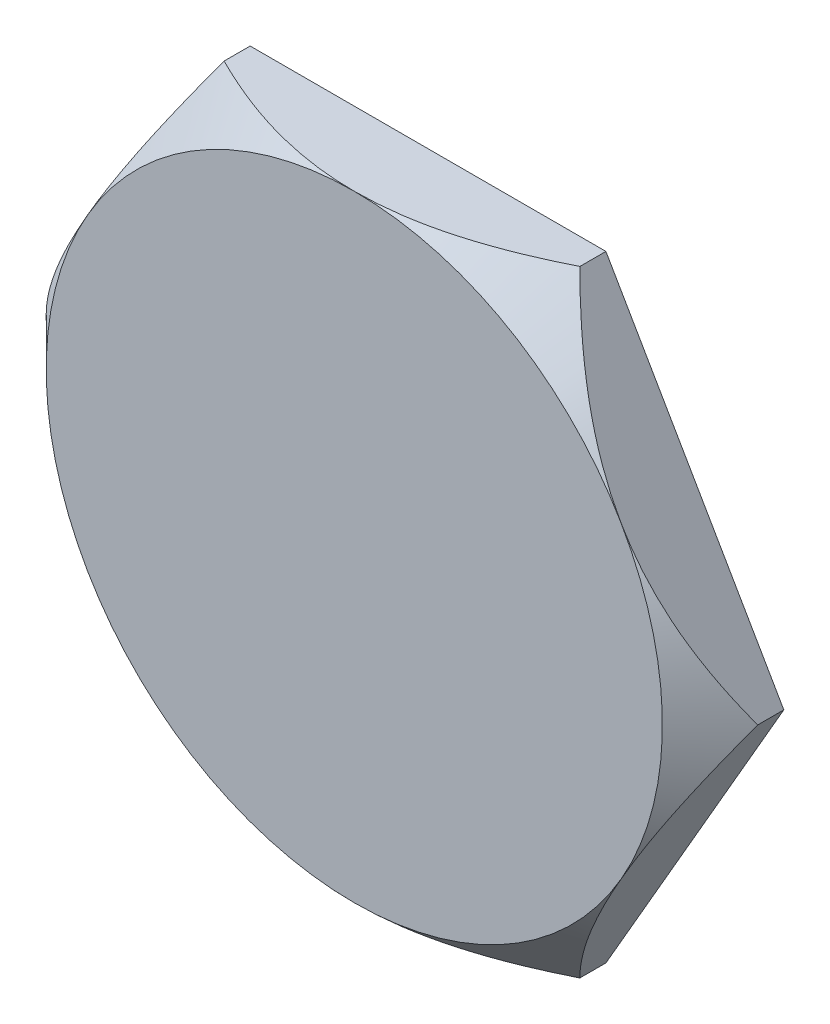
ISO-10303-21;
HEADER;
FILE_DESCRIPTION(('STEP AP214'),'2;1');
FILE_NAME('part.step','',(''),(''),'','','');
FILE_SCHEMA(('AUTOMOTIVE_DESIGN { 1 0 10303 214 1 1 1 1 }'));
ENDSEC;
DATA;
#1=APPLICATION_CONTEXT('core data for automotive mechanical design processes');
#2=APPLICATION_PROTOCOL_DEFINITION('international standard','automotive_design',2000,#1);
#3=PRODUCT_CONTEXT('',#1,'mechanical');
#4=PRODUCT('Part','Part','',(#3));
#5=PRODUCT_RELATED_PRODUCT_CATEGORY('part','',(#4));
#6=PRODUCT_DEFINITION_FORMATION('','',#4);
#7=PRODUCT_DEFINITION_CONTEXT('part definition',#1,'design');
#8=PRODUCT_DEFINITION('design','',#6,#7);
#9=PRODUCT_DEFINITION_SHAPE('','',#8);
#10=(LENGTH_UNIT() NAMED_UNIT(*) SI_UNIT(.MILLI.,.METRE.));
#11=(NAMED_UNIT(*) PLANE_ANGLE_UNIT() SI_UNIT($,.RADIAN.));
#12=(NAMED_UNIT(*) SI_UNIT($,.STERADIAN.) SOLID_ANGLE_UNIT());
#13=UNCERTAINTY_MEASURE_WITH_UNIT(LENGTH_MEASURE(1.E-05),#10,'distance_accuracy_value','');
#14=(GEOMETRIC_REPRESENTATION_CONTEXT(3) GLOBAL_UNCERTAINTY_ASSIGNED_CONTEXT((#13)) GLOBAL_UNIT_ASSIGNED_CONTEXT((#10,
#11,#12)) REPRESENTATION_CONTEXT('',''));
#15=CARTESIAN_POINT('',(0.,0.,0.));
#16=DIRECTION('',(0.,0.,1.));
#17=DIRECTION('',(1.,0.,0.));
#18=AXIS2_PLACEMENT_3D('',#15,#16,#17);
#19=CARTESIAN_POINT('',(-21.7124639759004,-37.6070907637685,4.5));
#20=DIRECTION('',(0.,1.,0.));
#21=DIRECTION('',(-1.,0.,0.));
#22=AXIS2_PLACEMENT_3D('',#19,#20,#21);
#23=PLANE('',#22);
#24=CARTESIAN_POINT('',(-46.6070761552262,-37.6070907637685,-17.7804106322104));
#25=CARTESIAN_POINT('',(-46.0465122041379,-37.6070907637685,-17.3441656617392));
#26=CARTESIAN_POINT('',(-45.4844513069984,-37.6070907637685,-16.9098388694076));
#27=CARTESIAN_POINT('',(-44.3570811695108,-37.6070907637685,-16.0454042008227));
#28=CARTESIAN_POINT('',(-43.7917718780509,-37.6070907637685,-15.6152963912428));
#29=CARTESIAN_POINT('',(-42.6575407570866,-37.6070907637685,-14.7595999113468));
#30=CARTESIAN_POINT('',(-42.0886181443837,-37.6070907637685,-14.3340122782028));
#31=CARTESIAN_POINT('',(-40.9470151649295,-37.6070907637685,-13.4879142216941));
#32=CARTESIAN_POINT('',(-40.3743348116376,-37.6070907637685,-13.0674037801592));
#33=CARTESIAN_POINT('',(-38.6413841793649,-37.6070907637685,-11.8078065347806));
#34=CARTESIAN_POINT('',(-37.4748982124811,-37.6070907637685,-10.97723527134));
#35=CARTESIAN_POINT('',(-35.1227738365268,-37.6070907637685,-9.34372126318951));
#36=CARTESIAN_POINT('',(-33.9371367364555,-37.6070907637685,-8.54077664181501));
#37=CARTESIAN_POINT('',(-32.101445215132,-37.6070907637685,-7.3354468559602));
#38=CARTESIAN_POINT('',(-31.4594045293849,-37.6070907637685,-6.92084282984317));
#39=CARTESIAN_POINT('',(-30.1683774753947,-37.6070907637685,-6.10260528101257));
#40=CARTESIAN_POINT('',(-29.5193912665659,-37.6070907637685,-5.69897150725791));
#41=CARTESIAN_POINT('',(-28.213747689679,-37.6070907637685,-4.90397852127615));
#42=CARTESIAN_POINT('',(-27.5570887496011,-37.6070907637685,-4.51262188718028));
#43=CARTESIAN_POINT('',(-26.2356271598997,-37.6070907637685,-3.74389133652448));
#44=CARTESIAN_POINT('',(-25.5708245616867,-37.6070907637685,-3.36651733175342));
#45=CARTESIAN_POINT('',(-24.2344716432003,-37.6070907637685,-2.62872764427486));
#46=CARTESIAN_POINT('',(-23.5629477133181,-37.6070907637685,-2.26826425881349));
#47=CARTESIAN_POINT('',(-22.2105683983219,-37.6070907637685,-1.56519972492261));
#48=CARTESIAN_POINT('',(-21.5297127724301,-37.6070907637685,-1.22259903848886));
#49=CARTESIAN_POINT('',(-20.1584116673308,-37.6070907637685,-0.557828694449262));
#50=CARTESIAN_POINT('',(-19.4679701569735,-37.6070907637685,-0.235650871578658));
#51=CARTESIAN_POINT('',(-18.076831617732,-37.6070907637685,0.385659036432917));
#52=CARTESIAN_POINT('',(-17.3761355408192,-37.6070907637685,0.684793244855004));
#53=CARTESIAN_POINT('',(-16.0412253495955,-37.6070907637685,1.22575449664763));
#54=CARTESIAN_POINT('',(-15.4081037121355,-37.6070907637685,1.47027271485531));
#55=CARTESIAN_POINT('',(-14.1334248021832,-37.6070907637685,1.93626678659655));
#56=CARTESIAN_POINT('',(-13.4918677633325,-37.6070907637685,2.15774327682634));
#57=CARTESIAN_POINT('',(-12.2003645553576,-37.6070907637685,2.57522094510857));
#58=CARTESIAN_POINT('',(-11.5504169534563,-37.6070907637685,2.7712177072427));
#59=CARTESIAN_POINT('',(-10.2427216382156,-37.6070907637685,3.135148166157));
#60=CARTESIAN_POINT('',(-9.584974426446,-37.6070907637684,3.30308365710511));
#61=CARTESIAN_POINT('',(-8.27555337079421,-37.6070907637684,3.60539697972731));
#62=CARTESIAN_POINT('',(-7.62401881113733,-37.6070907637684,3.74037566299787));
#63=CARTESIAN_POINT('',(-6.31519301893971,-37.6070907637684,3.97887316112736));
#64=CARTESIAN_POINT('',(-5.6579018347709,-37.6070907637684,4.08239224007546));
#65=CARTESIAN_POINT('',(-4.33902826388844,-37.6070907637684,4.25615608312055));
#66=CARTESIAN_POINT('',(-3.67744663031032,-37.6070907637684,4.32640653498199));
#67=CARTESIAN_POINT('',(-2.35151381581326,-37.6070907637684,4.43234797159201));
#68=CARTESIAN_POINT('',(-1.68716267911826,-37.6070907637684,4.46803950607713));
#69=CARTESIAN_POINT('',(-0.390063004716149,-37.6070907637684,4.50328910018695));
#70=CARTESIAN_POINT('',(0.242640151598522,-37.6070907637684,4.50453083654414));
#71=CARTESIAN_POINT('',(1.50729555427424,-37.6070907637684,4.4751148857415));
#72=CARTESIAN_POINT('',(2.13924781014715,-37.6070907637684,4.44445760706235));
#73=CARTESIAN_POINT('',(3.40087419078574,-37.6070907637684,4.35178139607283));
#74=CARTESIAN_POINT('',(4.03054817772566,-37.6070907637684,4.28976059732354));
#75=CARTESIAN_POINT('',(5.28616031358893,-37.6070907637684,4.13541011751139));
#76=CARTESIAN_POINT('',(5.91209841126155,-37.6070907637684,4.04308002161956));
#77=CARTESIAN_POINT('',(7.17051583673139,-37.6070907637684,3.82761606864158));
#78=CARTESIAN_POINT('',(7.80290292569838,-37.6070907637684,3.70394555385454));
#79=CARTESIAN_POINT('',(9.06155083751061,-37.6070907637684,3.42857211268428));
#80=CARTESIAN_POINT('',(9.68781132090493,-37.6070907637684,3.27686764220949));
#81=CARTESIAN_POINT('',(10.9333578120611,-37.6070907637684,2.94753430316616));
#82=CARTESIAN_POINT('',(11.5526448355335,-37.6070907637684,2.76990926404324));
#83=CARTESIAN_POINT('',(12.7838767947179,-37.6070907637684,2.39087646094673));
#84=CARTESIAN_POINT('',(13.3958214277314,-37.6070907637684,2.18946772014844));
#85=CARTESIAN_POINT('',(15.2662711132351,-37.6070907637684,1.5367484378894));
#86=CARTESIAN_POINT('',(16.512372619508,-37.6070907637684,1.04962238439399));
#87=CARTESIAN_POINT('',(18.9725047594724,-37.6070907637684,-3.44303785086491E-05));
#88=CARTESIAN_POINT('',(20.1865208953195,-37.6070907637684,-0.562598604071179));
#89=CARTESIAN_POINT('',(22.5883188882315,-37.6070907637684,-1.74986323153771));
#90=CARTESIAN_POINT('',(23.7760065478447,-37.6070907637684,-2.37475299053555));
#91=CARTESIAN_POINT('',(26.1242080785083,-37.6070907637684,-3.67293186269795));
#92=CARTESIAN_POINT('',(27.2847260297507,-37.6070907637684,-4.34621364600865));
#93=CARTESIAN_POINT('',(29.5255271543739,-37.6070907637684,-5.69763304346176));
#94=CARTESIAN_POINT('',(30.6069463002423,-37.6070907637684,-6.37389699816166));
#95=CARTESIAN_POINT('',(32.7512149168632,-37.6070907637684,-7.75534878641033));
#96=CARTESIAN_POINT('',(33.8140629956001,-37.6070907637684,-8.46053877499332));
#97=CARTESIAN_POINT('',(35.3919102870586,-37.6070907637684,-9.53333751004187));
#98=CARTESIAN_POINT('',(35.91305287768,-37.6070907637684,-9.89196334277404));
#99=CARTESIAN_POINT('',(36.9516070474895,-37.6070907637684,-10.6145874078134));
#100=CARTESIAN_POINT('',(37.469018608932,-37.6070907637684,-10.9785856656479));
#101=CARTESIAN_POINT('',(38.5002147546282,-37.6070907637684,-11.711383898885));
#102=CARTESIAN_POINT('',(39.0140002857895,-37.6070907637684,-12.0801825433076));
#103=CARTESIAN_POINT('',(40.0383031988636,-37.6070907637684,-12.8222698081059));
#104=CARTESIAN_POINT('',(40.5488206478406,-37.6070907637684,-13.1955583358895));
#105=CARTESIAN_POINT('',(41.0578230663147,-37.6070907637684,-13.5708951073019));
#106=B_SPLINE_CURVE_WITH_KNOTS('',3,(#24,#25,#26,#27,#28,#29,#30,#31,#32,#33,#34,#35,#36,#37,
#38,#39,#40,#41,#42,#43,#44,#45,#46,#47,#48,#49,#50,#51,#52,#53,#54,#55,#56,#57,#58,#59,#60,#61,
#62,#63,#64,#65,#66,#67,#68,#69,#70,#71,#72,#73,#74,#75,#76,#77,#78,#79,#80,#81,#82,#83,#84,#85,
#86,#87,#88,#89,#90,#91,#92,#93,#94,#95,#96,#97,#98,#99,#100,#101,#102,#103,#104,#105),
.UNSPECIFIED.,.F.,.F.,(4,2,2,2,2,2,2,2,2,2,2,2,2,2,2,2,2,2,2,2,2,2,2,2,2,2,2,2,2,2,2,2,2,2,2,2,
2,2,2,2,4),(0.,2.1309332898809,4.26190020126027,6.39334594332045,8.5247840551468,
12.8203673573192,17.1156582841464,19.4083857015027,21.7010606082844,23.9942137843681,
26.2873524913517,28.5735767873632,30.8598601843276,33.1452236608654,35.430376307297,
37.4660758896623,39.5017192059917,41.5377148527886,43.5735802732324,45.5689654291827,
47.5643338343127,49.5593609784015,51.5543563866197,53.4516684258427,55.3489561694644,
57.2463568337178,59.1437834678765,61.0762008430554,63.0087246862347,64.9409633112593,
66.8732813232236,70.8836422160816,74.8957852473451,78.9205088794362,82.9446241733035,
86.7704713644326,90.5966041066354,92.4944241771625,94.3922532682056,96.2895669154888,
98.1868415024969),.UNSPECIFIED.);
#107=CARTESIAN_POINT('',(-21.7124639759004,-37.6070907637685,-1.31783718803233));
#108=VERTEX_POINT('',#107);
#109=CARTESIAN_POINT('',(0.,-37.6070907637684,4.5));
#110=VERTEX_POINT('',#109);
#111=EDGE_CURVE('E175',#108,#110,#106,.T.);
#112=ORIENTED_EDGE('',*,*,#111,.F.);
#113=DIRECTION('',(0.,0.,-1.));
#114=VECTOR('',#113,1.);
#115=CARTESIAN_POINT('',(-21.7124639759004,-37.6070907637685,4.5));
#116=LINE('',#115,#114);
#117=CARTESIAN_POINT('',(-21.7124639759004,-37.6070907637685,-4.5));
#118=VERTEX_POINT('',#117);
#119=EDGE_CURVE('E193',#108,#118,#116,.T.);
#120=ORIENTED_EDGE('',*,*,#119,.T.);
#121=DIRECTION('',(1.,0.,0.));
#122=VECTOR('',#121,1.);
#123=CARTESIAN_POINT('',(-21.7124639759004,-37.6070907637685,-4.5));
#124=LINE('',#123,#122);
#125=CARTESIAN_POINT('',(21.7124639759004,-37.6070907637684,-4.5));
#126=VERTEX_POINT('',#125);
#127=EDGE_CURVE('E176',#118,#126,#124,.T.);
#128=ORIENTED_EDGE('',*,*,#127,.T.);
#129=DIRECTION('',(0.,0.,-1.));
#130=VECTOR('',#129,1.);
#131=CARTESIAN_POINT('',(21.7124639759004,-37.6070907637684,4.5));
#132=LINE('',#131,#130);
#133=CARTESIAN_POINT('',(21.7124639759004,-37.6070907637684,-1.31783718803233));
#134=VERTEX_POINT('',#133);
#135=EDGE_CURVE('E201',#134,#126,#132,.T.);
#136=ORIENTED_EDGE('',*,*,#135,.F.);
#137=EDGE_CURVE('E170',#110,#134,#106,.T.);
#138=ORIENTED_EDGE('',*,*,#137,.F.);
#139=EDGE_LOOP('',(#112,#120,#128,#136,#138));
#140=FACE_BOUND('',#139,.T.);
#141=ADVANCED_FACE('F34',(#140),#23,.F.);
#142=CARTESIAN_POINT('',(21.7124639759004,-37.6070907637684,4.5));
#143=DIRECTION('',(-0.866025403784439,0.5,0.));
#144=DIRECTION('',(-0.5,-0.866025403784439,0.));
#145=AXIS2_PLACEMENT_3D('',#142,#143,#144);
#146=PLANE('',#145);
#147=CARTESIAN_POINT('',(21.7123485058466,-37.6072907637684,-1.31795265854673));
#148=CARTESIAN_POINT('',(22.0856259462278,-36.9607552717088,-0.944736650521798));
#149=CARTESIAN_POINT('',(22.461826738061,-36.3091563864062,-0.582909487794439));
#150=CARTESIAN_POINT('',(23.2205299463218,-34.9950438818329,0.114349642792548));
#151=CARTESIAN_POINT('',(23.6030356681623,-34.3325245374194,0.449767196135109));
#152=CARTESIAN_POINT('',(24.3766076380147,-32.9926585823239,1.09200996952665));
#153=CARTESIAN_POINT('',(24.7677103592322,-32.3152487981968,1.39866049674521));
#154=CARTESIAN_POINT('',(25.5563395703937,-30.9493029361321,1.97670914290367));
#155=CARTESIAN_POINT('',(25.9538650677993,-30.2607685773215,2.24811265121986));
#156=CARTESIAN_POINT('',(26.7489164258032,-28.883699230632,2.74706167814564));
#157=CARTESIAN_POINT('',(27.1463441285632,-28.1953342571164,2.97522933882488));
#158=CARTESIAN_POINT('',(27.9468365932372,-26.8088406372249,3.38834000184434));
#159=CARTESIAN_POINT('',(28.3499016309531,-26.1107115131464,3.57328088145635));
#160=CARTESIAN_POINT('',(29.1598345290785,-24.7078665828717,3.89523217625616));
#161=CARTESIAN_POINT('',(29.5666912336448,-24.0031700991627,4.03235415121108));
#162=CARTESIAN_POINT('',(30.3838713043739,-22.5877726977273,4.25564019967726));
#163=CARTESIAN_POINT('',(30.7941941432783,-21.877072693239,4.34181188689808));
#164=CARTESIAN_POINT('',(31.4997652516868,-20.6549876851227,4.44386409476112));
#165=CARTESIAN_POINT('',(31.7945566016942,-20.1443940892781,4.4727648187823));
#166=CARTESIAN_POINT('',(32.3844882375751,-19.1226025229402,4.50281744341954));
#167=CARTESIAN_POINT('',(32.6796285051604,-18.611404584123,4.50397073906042));
#168=CARTESIAN_POINT('',(33.2697121504087,-17.5893497298374,4.47850107957706));
#169=CARTESIAN_POINT('',(33.5646554186652,-17.0784930038668,4.45186810613394));
#170=CARTESIAN_POINT('',(34.1536061629225,-16.0584003916576,4.3712220674623));
#171=CARTESIAN_POINT('',(34.4476136227925,-15.5491645333584,4.31720853281129));
#172=CARTESIAN_POINT('',(35.0344129490022,-14.5327982865162,4.18253247535898));
#173=CARTESIAN_POINT('',(35.3272031658656,-14.0256707549496,4.10184132495312));
#174=CARTESIAN_POINT('',(35.9107354997968,-13.0149631047216,3.91496633140012));
#175=CARTESIAN_POINT('',(36.2014776058378,-12.5113830051589,3.80878235111139));
#176=CARTESIAN_POINT('',(36.7804461287125,-11.5085801075568,3.57233455002204));
#177=CARTESIAN_POINT('',(37.068672952368,-11.0093566048813,3.4420747017835));
#178=CARTESIAN_POINT('',(37.6423547004372,-10.0157106698506,3.15902090056446));
#179=CARTESIAN_POINT('',(37.9278094000852,-9.52128862680086,3.00622513635048));
#180=CARTESIAN_POINT('',(38.6627013013757,-8.24841851569492,2.58374499155166));
#181=CARTESIAN_POINT('',(39.1098660729266,-7.47390641201382,2.29815828359477));
#182=CARTESIAN_POINT('',(39.9961175822086,-5.93887376965267,1.68099771157389));
#183=CARTESIAN_POINT('',(40.4352040757062,-5.17835365399768,1.34942245970026));
#184=CARTESIAN_POINT('',(41.3039999451057,-3.67355506679169,0.647645542359305));
#185=CARTESIAN_POINT('',(41.733733932619,-2.92923396667943,0.27756535512528));
#186=CARTESIAN_POINT('',(42.3723951275293,-1.82304032827227,-0.302809662360994));
#187=CARTESIAN_POINT('',(42.5842368697311,-1.45611966761483,-0.500421407929406));
#188=CARTESIAN_POINT('',(43.0060338067594,-0.725545942204833,-0.903468166903739));
#189=CARTESIAN_POINT('',(43.2159891367525,-0.361892643336918,-1.1089026141767));
#190=CARTESIAN_POINT('',(43.4250434218546,0.000199999999997124,-1.31795265854674));
#191=B_SPLINE_CURVE_WITH_KNOTS('',3,(#147,#148,#149,#150,#151,#152,#153,#154,#155,#156,#157,
#158,#159,#160,#161,#162,#163,#164,#165,#166,#167,#168,#169,#170,#171,#172,#173,#174,#175,#176,
#177,#178,#179,#180,#181,#182,#183,#184,#185,#186,#187,#188,#189,#190),.UNSPECIFIED.,.F.,.F.,(4,
2,2,2,2,2,2,2,2,2,2,2,2,2,2,2,2,2,2,2,2,4),(0.,2.50404489581569,5.00944717369364,
7.52919351323412,10.0485541211521,12.5283272627185,15.0082221523967,17.4822922130285,
19.9559924697682,21.7262594186489,23.496437365714,25.2672537697735,27.0381005343924,
28.8108537865815,30.5836165757141,32.356087116464,34.128700190101,36.9436086318917,
39.7586020384816,42.5649693330906,43.9674097963991,45.3697489565476),.UNSPECIFIED.);
#192=CARTESIAN_POINT('',(32.5686959638506,-18.8035453818842,4.5));
#193=VERTEX_POINT('',#192);
#194=EDGE_CURVE('E168',#134,#193,#191,.T.);
#195=ORIENTED_EDGE('',*,*,#194,.F.);
#196=ORIENTED_EDGE('',*,*,#135,.T.);
#197=DIRECTION('',(0.5,0.866025403784438,0.));
#198=VECTOR('',#197,1.);
#199=CARTESIAN_POINT('',(21.7124639759004,-37.6070907637684,-4.5));
#200=LINE('',#199,#198);
#201=CARTESIAN_POINT('',(43.4249279518008,0.,-4.5));
#202=VERTEX_POINT('',#201);
#203=EDGE_CURVE('E179',#126,#202,#200,.T.);
#204=ORIENTED_EDGE('',*,*,#203,.T.);
#205=DIRECTION('',(0.,0.,-1.));
#206=VECTOR('',#205,1.);
#207=CARTESIAN_POINT('',(43.4249279518008,0.,4.5));
#208=LINE('',#207,#206);
#209=CARTESIAN_POINT('',(43.4249279518008,0.,-1.31783718803234));
#210=VERTEX_POINT('',#209);
#211=EDGE_CURVE('E200',#210,#202,#208,.T.);
#212=ORIENTED_EDGE('',*,*,#211,.F.);
#213=EDGE_CURVE('E163',#193,#210,#191,.T.);
#214=ORIENTED_EDGE('',*,*,#213,.F.);
#215=EDGE_LOOP('',(#195,#196,#204,#212,#214));
#216=FACE_BOUND('',#215,.T.);
#217=ADVANCED_FACE('F158',(#216),#146,.F.);
#218=CARTESIAN_POINT('',(43.4249279518008,0.,4.5));
#219=DIRECTION('',(-0.866025403784438,-0.5,0.));
#220=DIRECTION('',(0.5,-0.866025403784439,0.));
#221=AXIS2_PLACEMENT_3D('',#218,#219,#220);
#222=PLANE('',#221);
#223=CARTESIAN_POINT('',(43.4250434218546,-0.000200000000001614,-1.31795265854674));
#224=CARTESIAN_POINT('',(43.0517659814734,0.6463354920596,-0.944736650521808));
#225=CARTESIAN_POINT('',(42.6755651896402,1.29793437736229,-0.582909487794447));
#226=CARTESIAN_POINT('',(41.9168619813794,2.61204688193551,0.114349642792548));
#227=CARTESIAN_POINT('',(41.5343562595389,3.27456622634904,0.449767196135113));
#228=CARTESIAN_POINT('',(40.7607842896865,4.61443218144455,1.09200996952665));
#229=CARTESIAN_POINT('',(40.369681568469,5.29184196557166,1.39866049674521));
#230=CARTESIAN_POINT('',(39.5810523573075,6.65778782763634,1.97670914290367));
#231=CARTESIAN_POINT('',(39.1835268599019,7.34632218644696,2.24811265121986));
#232=CARTESIAN_POINT('',(38.388475501898,8.72339153313645,2.74706167814565));
#233=CARTESIAN_POINT('',(37.991047799138,9.41175650665206,2.97522933882488));
#234=CARTESIAN_POINT('',(37.190555334464,10.7982501265436,3.38834000184434));
#235=CARTESIAN_POINT('',(36.7874902967481,11.4963792506221,3.57328088145636));
#236=CARTESIAN_POINT('',(35.9775573986227,12.8992241808968,3.89523217625617));
#237=CARTESIAN_POINT('',(35.5707006940564,13.6039206646057,4.03235415121108));
#238=CARTESIAN_POINT('',(34.7535206233273,15.0193180660412,4.25564019967727));
#239=CARTESIAN_POINT('',(34.3431977844229,15.7300180705294,4.34181188689808));
#240=CARTESIAN_POINT('',(33.6376266760144,16.9521030786458,4.44386409476112));
#241=CARTESIAN_POINT('',(33.342835326007,17.4626966744903,4.4727648187823));
#242=CARTESIAN_POINT('',(32.7529036901262,18.4844882408282,4.50281744341954));
#243=CARTESIAN_POINT('',(32.4577634225408,18.9956861796455,4.50397073906042));
#244=CARTESIAN_POINT('',(31.8676797772925,20.0177410339311,4.47850107957706));
#245=CARTESIAN_POINT('',(31.572736509036,20.5285977599017,4.45186810613394));
#246=CARTESIAN_POINT('',(30.9837857647787,21.5486903721108,4.3712220674623));
#247=CARTESIAN_POINT('',(30.6897783049087,22.05792623041,4.3172085328113));
#248=CARTESIAN_POINT('',(30.102978978699,23.0742924772523,4.18253247535899));
#249=CARTESIAN_POINT('',(29.8101887618356,23.5814200088188,4.10184132495313));
#250=CARTESIAN_POINT('',(29.2266564279044,24.5921276590469,3.91496633140014));
#251=CARTESIAN_POINT('',(28.9359143218634,25.0957077586095,3.8087823511114));
#252=CARTESIAN_POINT('',(28.3569457989887,26.0985106562116,3.57233455002205));
#253=CARTESIAN_POINT('',(28.0687189753332,26.5977341588872,3.44207470178351));
#254=CARTESIAN_POINT('',(27.495037227264,27.5913800939179,3.15902090056447));
#255=CARTESIAN_POINT('',(27.209582527616,28.0858021369676,3.00622513635049));
#256=CARTESIAN_POINT('',(26.4746906263256,29.3586722480735,2.58374499155168));
#257=CARTESIAN_POINT('',(26.0275258547746,30.1331843517546,2.29815828359478));
#258=CARTESIAN_POINT('',(25.1412743454926,31.6682169941158,1.6809977115739));
#259=CARTESIAN_POINT('',(24.702187851995,32.4287371097708,1.34942245970027));
#260=CARTESIAN_POINT('',(23.8333919825955,33.9335356969768,0.647645542359315));
#261=CARTESIAN_POINT('',(23.4036579950822,34.677856797089,0.277565355125287));
#262=CARTESIAN_POINT('',(22.7649968001719,35.7840504354962,-0.302809662360987));
#263=CARTESIAN_POINT('',(22.5531550579701,36.1509710961536,-0.5004214079294));
#264=CARTESIAN_POINT('',(22.1313581209418,36.8815448215636,-0.903468166903732));
#265=CARTESIAN_POINT('',(21.9214027909487,37.2451981204315,-1.10890261417669));
#266=CARTESIAN_POINT('',(21.7123485058466,37.6072907637684,-1.31795265854673));
#267=B_SPLINE_CURVE_WITH_KNOTS('',3,(#223,#224,#225,#226,#227,#228,#229,#230,#231,#232,#233,
#234,#235,#236,#237,#238,#239,#240,#241,#242,#243,#244,#245,#246,#247,#248,#249,#250,#251,#252,
#253,#254,#255,#256,#257,#258,#259,#260,#261,#262,#263,#264,#265,#266),.UNSPECIFIED.,.F.,.F.,(4,
2,2,2,2,2,2,2,2,2,2,2,2,2,2,2,2,2,2,2,2,4),(0.,2.50404489581569,5.00944717369365,
7.52919351323414,10.0485541211521,12.5283272627185,15.0082221523967,17.4822922130285,
19.9559924697682,21.7262594186489,23.496437365714,25.2672537697736,27.0381005343924,
28.8108537865815,30.5836165757141,32.356087116464,34.128700190101,36.9436086318917,
39.7586020384817,42.5649693330906,43.9674097963991,45.3697489565477),.UNSPECIFIED.);
#268=CARTESIAN_POINT('',(32.5686959638506,18.8035453818842,4.5));
#269=VERTEX_POINT('',#268);
#270=EDGE_CURVE('E169',#210,#269,#267,.T.);
#271=ORIENTED_EDGE('',*,*,#270,.F.);
#272=ORIENTED_EDGE('',*,*,#211,.T.);
#273=DIRECTION('',(-0.5,0.866025403784438,0.));
#274=VECTOR('',#273,1.);
#275=CARTESIAN_POINT('',(43.4249279518008,0.,-4.5));
#276=LINE('',#275,#274);
#277=CARTESIAN_POINT('',(21.7124639759004,37.6070907637684,-4.5));
#278=VERTEX_POINT('',#277);
#279=EDGE_CURVE('E182',#202,#278,#276,.T.);
#280=ORIENTED_EDGE('',*,*,#279,.T.);
#281=DIRECTION('',(0.,0.,-1.));
#282=VECTOR('',#281,1.);
#283=CARTESIAN_POINT('',(21.7124639759004,37.6070907637684,4.5));
#284=LINE('',#283,#282);
#285=CARTESIAN_POINT('',(21.7124639759004,37.6070907637684,-1.31783718803233));
#286=VERTEX_POINT('',#285);
#287=EDGE_CURVE('E198',#286,#278,#284,.T.);
#288=ORIENTED_EDGE('',*,*,#287,.F.);
#289=EDGE_CURVE('E108',#269,#286,#267,.T.);
#290=ORIENTED_EDGE('',*,*,#289,.F.);
#291=EDGE_LOOP('',(#271,#272,#280,#288,#290));
#292=FACE_BOUND('',#291,.T.);
#293=ADVANCED_FACE('F153',(#292),#222,.F.);
#294=CARTESIAN_POINT('',(21.7124639759004,37.6070907637684,4.5));
#295=DIRECTION('',(0.,-1.,0.));
#296=DIRECTION('',(1.,0.,0.));
#297=AXIS2_PLACEMENT_3D('',#294,#295,#296);
#298=PLANE('',#297);
#299=CARTESIAN_POINT('',(-46.607076155059,37.6070907637684,-17.7804106320802));
#300=CARTESIAN_POINT('',(-46.0465122039731,37.6070907637684,-17.3441656616115));
#301=CARTESIAN_POINT('',(-45.484451306836,37.6070907637684,-16.9098388692825));
#302=CARTESIAN_POINT('',(-44.3570811693534,37.6070907637684,-16.0454042007027));
#303=CARTESIAN_POINT('',(-43.791771877896,37.6070907637684,-15.6152963911252));
#304=CARTESIAN_POINT('',(-42.6575407569366,37.6070907637684,-14.7595999112343));
#305=CARTESIAN_POINT('',(-42.0886181442362,37.6070907637684,-14.3340122780928));
#306=CARTESIAN_POINT('',(-40.9470151647869,37.6070907637684,-13.4879142215891));
#307=CARTESIAN_POINT('',(-40.3743348114975,37.6070907637684,-13.0674037800567));
#308=CARTESIAN_POINT('',(-38.6413841792324,37.6070907637684,-11.8078065346857));
#309=CARTESIAN_POINT('',(-37.4748982123538,37.6070907637684,-10.9772352712502));
#310=CARTESIAN_POINT('',(-35.1227738364098,37.6070907637684,-9.34372126310967));
#311=CARTESIAN_POINT('',(-33.9371367363438,37.6070907637684,-8.54077664174014));
#312=CARTESIAN_POINT('',(-32.1014452150285,37.6070907637684,-7.33544685589299));
#313=CARTESIAN_POINT('',(-31.4594045292844,37.6070907637684,-6.92084282977868));
#314=CARTESIAN_POINT('',(-30.1683774753002,37.6070907637684,-6.10260528095348));
#315=CARTESIAN_POINT('',(-29.5193912664746,37.6070907637684,-5.69897150720149));
#316=CARTESIAN_POINT('',(-28.2137476895938,37.6070907637684,-4.90397852122502));
#317=CARTESIAN_POINT('',(-27.557088749519,37.6070907637684,-4.51262188713176));
#318=CARTESIAN_POINT('',(-26.2356271598239,37.6070907637684,-3.7438913364811));
#319=CARTESIAN_POINT('',(-25.5708245616141,37.6070907637684,-3.36651733171258));
#320=CARTESIAN_POINT('',(-24.234471643134,37.6070907637684,-2.62872764423897));
#321=CARTESIAN_POINT('',(-23.562947713255,37.6070907637684,-2.26826425878004));
#322=CARTESIAN_POINT('',(-22.2105683982653,37.6070907637684,-1.56519972489388));
#323=CARTESIAN_POINT('',(-21.5297127723769,37.6070907637684,-1.22259903846243));
#324=CARTESIAN_POINT('',(-20.1584116672842,37.6070907637684,-0.55782869442728));
#325=CARTESIAN_POINT('',(-19.4679701569304,37.6070907637684,-0.235650871558829));
#326=CARTESIAN_POINT('',(-18.0768316176957,37.6070907637684,0.385659036448627));
#327=CARTESIAN_POINT('',(-17.3761355407863,37.6070907637684,0.684793244868748));
#328=CARTESIAN_POINT('',(-16.0412253495641,37.6070907637684,1.22575449666));
#329=CARTESIAN_POINT('',(-15.408103712102,37.6070907637684,1.47027271486808));
#330=CARTESIAN_POINT('',(-14.1334248021453,37.6070907637684,1.93626678660993));
#331=CARTESIAN_POINT('',(-13.4918677632924,37.6070907637684,2.15774327683993));
#332=CARTESIAN_POINT('',(-12.2003645553131,37.6070907637684,2.57522094512237));
#333=CARTESIAN_POINT('',(-11.5504169534095,37.6070907637684,2.77121770725648));
#334=CARTESIAN_POINT('',(-10.2427216381643,37.6070907637684,3.13514816617053));
#335=CARTESIAN_POINT('',(-9.58497442639244,37.6070907637684,3.30308365711839));
#336=CARTESIAN_POINT('',(-8.27555337073618,37.6070907637684,3.60539697973983));
#337=CARTESIAN_POINT('',(-7.62401881107711,37.6070907637684,3.74037566300988));
#338=CARTESIAN_POINT('',(-6.31519301887513,37.6070907637684,3.9788731611381));
#339=CARTESIAN_POINT('',(-5.65790183470413,37.6070907637684,4.08239224008544));
#340=CARTESIAN_POINT('',(-4.33902826381733,37.6070907637684,4.25615608312875));
#341=CARTESIAN_POINT('',(-3.67744663023706,37.6070907637684,4.32640653498917));
#342=CARTESIAN_POINT('',(-2.35151381573573,37.6070907637684,4.4323479715969));
#343=CARTESIAN_POINT('',(-1.68716267903862,37.6070907637684,4.46803950608074));
#344=CARTESIAN_POINT('',(-0.390063004633007,37.6070907637684,4.50328910018784));
#345=CARTESIAN_POINT('',(0.242640151683058,37.6070907637684,4.50453083654362));
#346=CARTESIAN_POINT('',(1.50729555436148,37.6070907637684,4.47511488573803));
#347=CARTESIAN_POINT('',(2.13924781023571,37.6070907637684,4.44445760705734));
#348=CARTESIAN_POINT('',(3.40087419087686,37.6070907637684,4.35178139606465));
#349=CARTESIAN_POINT('',(4.03054817781801,37.6070907637684,4.28976059731372));
#350=CARTESIAN_POINT('',(5.28616031368367,37.6070907637684,4.13541011749821));
#351=CARTESIAN_POINT('',(5.91209841135745,37.6070907637684,4.04308002160468));
#352=CARTESIAN_POINT('',(7.17051583682964,37.6070907637684,3.82761606862319));
#353=CARTESIAN_POINT('',(7.80290292579783,37.6070907637684,3.70394555383434));
#354=CARTESIAN_POINT('',(9.06155083761238,37.6070907637684,3.42857211266045));
#355=CARTESIAN_POINT('',(9.68781132100783,37.6070907637684,3.27686764218383));
#356=CARTESIAN_POINT('',(10.9333578121662,37.6070907637684,2.94753430313683));
#357=CARTESIAN_POINT('',(11.5526448356396,37.6070907637684,2.76990926401207));
#358=CARTESIAN_POINT('',(12.7838767948261,37.6070907637684,2.3908764609119));
#359=CARTESIAN_POINT('',(13.3958214278406,37.6070907637684,2.1894677201118));
#360=CARTESIAN_POINT('',(15.2662711133557,37.6070907637684,1.53674843784429));
#361=CARTESIAN_POINT('',(16.5123726196387,37.6070907637684,1.04962238434165));
#362=CARTESIAN_POINT('',(18.9725047596226,37.6070907637684,-3.443044602181E-05));
#363=CARTESIAN_POINT('',(20.1865208954793,37.6070907637684,-0.562598604146634));
#364=CARTESIAN_POINT('',(22.5883188884101,37.6070907637684,-1.74986323162954));
#365=CARTESIAN_POINT('',(23.7760065480325,37.6070907637684,-2.3747529906358));
#366=CARTESIAN_POINT('',(26.1242080787141,37.6070907637684,-3.67293186281533));
#367=CARTESIAN_POINT('',(27.2847260299655,37.6070907637684,-4.34621364613472));
#368=CARTESIAN_POINT('',(29.5255271546049,37.6070907637684,-5.69763304360433));
#369=CARTESIAN_POINT('',(30.6069463004805,37.6070907637684,-6.373896998312));
#370=CARTESIAN_POINT('',(32.7512149171158,37.6070907637684,-7.75534878657624));
#371=CARTESIAN_POINT('',(33.8140629958599,37.6070907637684,-8.46053877516702));
#372=CARTESIAN_POINT('',(35.3919102873291,37.6070907637684,-9.53333751022723));
#373=CARTESIAN_POINT('',(35.9130528779539,37.6070907637684,-9.89196334296326));
#374=CARTESIAN_POINT('',(36.9516070477704,37.6070907637684,-10.6145874080103));
#375=CARTESIAN_POINT('',(37.4690186092165,37.6070907637684,-10.9785856658487));
#376=CARTESIAN_POINT('',(38.5002147549196,37.6070907637684,-11.7113838990935));
#377=CARTESIAN_POINT('',(39.0140002860844,37.6070907637684,-12.0801825435199));
#378=CARTESIAN_POINT('',(40.0383031991654,37.6070907637684,-12.8222698083259));
#379=CARTESIAN_POINT('',(40.5488206481459,37.6070907637684,-13.1955583361134));
#380=CARTESIAN_POINT('',(41.0578230666235,37.6070907637684,-13.5708951075297));
#381=B_SPLINE_CURVE_WITH_KNOTS('',3,(#299,#300,#301,#302,#303,#304,#305,#306,#307,#308,#309,
#310,#311,#312,#313,#314,#315,#316,#317,#318,#319,#320,#321,#322,#323,#324,#325,#326,#327,#328,
#329,#330,#331,#332,#333,#334,#335,#336,#337,#338,#339,#340,#341,#342,#343,#344,#345,#346,#347,
#348,#349,#350,#351,#352,#353,#354,#355,#356,#357,#358,#359,#360,#361,#362,#363,#364,#365,#366,
#367,#368,#369,#370,#371,#372,#373,#374,#375,#376,#377,#378,#379,#380),.UNSPECIFIED.,.F.,.F.,(4,
2,2,2,2,2,2,2,2,2,2,2,2,2,2,2,2,2,2,2,2,2,2,2,2,2,2,2,2,2,2,2,2,2,2,2,2,2,2,2,4),(0.,
2.13093328987044,4.26190020123935,6.39334594328908,8.52478405510495,12.820367357256,
17.1156582840619,19.4083857014062,21.7010606081759,23.9942137842476,26.2873524912192,
28.5735767872187,30.8598601841711,33.145223660697,35.4303763071167,37.4660758894884,
39.5017192058243,41.5377148526276,43.5735802730778,45.5689654290342,47.5643338341703,
49.5593609782652,51.5543563864895,53.4516684257167,55.3489561693426,57.2463568336001,
59.143783467763,61.0762008429465,63.0087246861303,64.9409633111595,66.8732813231284,
70.8836422160223,74.8957852473218,78.9205088794491,82.9446241733527,86.7704713645126,
90.5966041067463,92.4944241772886,94.3922532683469,96.2895669156453,98.1868415026687),.UNSPECIFIED.);
#382=CARTESIAN_POINT('',(0.,37.6070907637684,4.5));
#383=VERTEX_POINT('',#382);
#384=EDGE_CURVE('E104',#286,#383,#381,.F.);
#385=ORIENTED_EDGE('',*,*,#384,.F.);
#386=ORIENTED_EDGE('',*,*,#287,.T.);
#387=DIRECTION('',(-1.,0.,0.));
#388=VECTOR('',#387,1.);
#389=CARTESIAN_POINT('',(21.7124639759004,37.6070907637684,-4.5));
#390=LINE('',#389,#388);
#391=CARTESIAN_POINT('',(-21.7124639759004,37.6070907637684,-4.5));
#392=VERTEX_POINT('',#391);
#393=EDGE_CURVE('E185',#278,#392,#390,.T.);
#394=ORIENTED_EDGE('',*,*,#393,.T.);
#395=DIRECTION('',(0.,0.,-1.));
#396=VECTOR('',#395,1.);
#397=CARTESIAN_POINT('',(-21.7124639759004,37.6070907637684,4.5));
#398=LINE('',#397,#396);
#399=CARTESIAN_POINT('',(-21.7124639759004,37.6070907637684,-1.31783718803233));
#400=VERTEX_POINT('',#399);
#401=EDGE_CURVE('E128',#400,#392,#398,.T.);
#402=ORIENTED_EDGE('',*,*,#401,.F.);
#403=EDGE_CURVE('E112',#383,#400,#381,.F.);
#404=ORIENTED_EDGE('',*,*,#403,.F.);
#405=EDGE_LOOP('',(#385,#386,#394,#402,#404));
#406=FACE_BOUND('',#405,.T.);
#407=ADVANCED_FACE('F126',(#406),#298,.F.);
#408=CARTESIAN_POINT('',(-21.7124639759004,37.6070907637684,4.5));
#409=DIRECTION('',(0.866025403784439,-0.5,0.));
#410=DIRECTION('',(0.5,0.866025403784439,0.));
#411=AXIS2_PLACEMENT_3D('',#408,#409,#410);
#412=PLANE('',#411);
#413=CARTESIAN_POINT('',(-21.7123485058466,37.6072907637684,-1.31795265854673));
#414=CARTESIAN_POINT('',(-22.0856259462278,36.9607552717088,-0.944736650521802));
#415=CARTESIAN_POINT('',(-22.461826738061,36.3091563864062,-0.582909487794443));
#416=CARTESIAN_POINT('',(-23.2205299463218,34.9950438818329,0.114349642792549));
#417=CARTESIAN_POINT('',(-23.6030356681623,34.3325245374194,0.449767196135113));
#418=CARTESIAN_POINT('',(-24.3766076380147,32.9926585823239,1.09200996952665));
#419=CARTESIAN_POINT('',(-24.7677103592322,32.3152487981968,1.39866049674521));
#420=CARTESIAN_POINT('',(-25.5563395703937,30.9493029361321,1.97670914290367));
#421=CARTESIAN_POINT('',(-25.9538650677993,30.2607685773215,2.24811265121986));
#422=CARTESIAN_POINT('',(-26.7489164258032,28.883699230632,2.74706167814564));
#423=CARTESIAN_POINT('',(-27.1463441285632,28.1953342571164,2.97522933882488));
#424=CARTESIAN_POINT('',(-27.9468365932372,26.8088406372249,3.38834000184434));
#425=CARTESIAN_POINT('',(-28.3499016309531,26.1107115131464,3.57328088145634));
#426=CARTESIAN_POINT('',(-29.1598345290785,24.7078665828717,3.89523217625616));
#427=CARTESIAN_POINT('',(-29.5666912336448,24.0031700991628,4.03235415121108));
#428=CARTESIAN_POINT('',(-30.3838713043739,22.5877726977273,4.25564019967726));
#429=CARTESIAN_POINT('',(-30.7941941432782,21.877072693239,4.34181188689808));
#430=CARTESIAN_POINT('',(-31.4997652516868,20.6549876851227,4.44386409476111));
#431=CARTESIAN_POINT('',(-31.7945566016942,20.1443940892781,4.4727648187823));
#432=CARTESIAN_POINT('',(-32.384488237575,19.1226025229403,4.50281744341953));
#433=CARTESIAN_POINT('',(-32.6796285051603,18.611404584123,4.50397073906041));
#434=CARTESIAN_POINT('',(-33.2697121504087,17.5893497298374,4.47850107957706));
#435=CARTESIAN_POINT('',(-33.5646554186652,17.0784930038668,4.45186810613394));
#436=CARTESIAN_POINT('',(-34.1536061629225,16.0584003916576,4.3712220674623));
#437=CARTESIAN_POINT('',(-34.4476136227925,15.5491645333585,4.3172085328113));
#438=CARTESIAN_POINT('',(-35.0344129490021,14.5327982865162,4.18253247535899));
#439=CARTESIAN_POINT('',(-35.3272031658656,14.0256707549496,4.10184132495312));
#440=CARTESIAN_POINT('',(-35.9107354997967,13.0149631047216,3.91496633140013));
#441=CARTESIAN_POINT('',(-36.2014776058378,12.511383005159,3.80878235111139));
#442=CARTESIAN_POINT('',(-36.7804461287125,11.5085801075569,3.57233455002205));
#443=CARTESIAN_POINT('',(-37.068672952368,11.0093566048813,3.44207470178351));
#444=CARTESIAN_POINT('',(-37.6423547004371,10.0157106698506,3.15902090056448));
#445=CARTESIAN_POINT('',(-37.9278094000852,9.5212886268009,3.00622513635048));
#446=CARTESIAN_POINT('',(-38.6627013013756,8.24841851569495,2.58374499155166));
#447=CARTESIAN_POINT('',(-39.1098660729265,7.47390641201385,2.29815828359478));
#448=CARTESIAN_POINT('',(-39.9961175822086,5.93887376965269,1.6809977115739));
#449=CARTESIAN_POINT('',(-40.4352040757062,5.17835365399769,1.34942245970026));
#450=CARTESIAN_POINT('',(-41.3039999451057,3.67355506679169,0.647645542359308));
#451=CARTESIAN_POINT('',(-41.733733932619,2.92923396667944,0.277565355125282));
#452=CARTESIAN_POINT('',(-42.3723951275293,1.82304032827227,-0.302809662360993));
#453=CARTESIAN_POINT('',(-42.5842368697311,1.45611966761483,-0.500421407929407));
#454=CARTESIAN_POINT('',(-43.0060338067594,0.725545942204829,-0.903468166903741));
#455=CARTESIAN_POINT('',(-43.2159891367525,0.361892643336911,-1.1089026141767));
#456=CARTESIAN_POINT('',(-43.4250434218546,-0.000200000000005097,-1.31795265854674));
#457=B_SPLINE_CURVE_WITH_KNOTS('',3,(#413,#414,#415,#416,#417,#418,#419,#420,#421,#422,#423,
#424,#425,#426,#427,#428,#429,#430,#431,#432,#433,#434,#435,#436,#437,#438,#439,#440,#441,#442,
#443,#444,#445,#446,#447,#448,#449,#450,#451,#452,#453,#454,#455,#456),.UNSPECIFIED.,.F.,.F.,(4,
2,2,2,2,2,2,2,2,2,2,2,2,2,2,2,2,2,2,2,2,4),(0.,2.50404489581568,5.00944717369363,
7.52919351323411,10.0485541211521,12.5283272627184,15.0082221523967,17.4822922130285,
19.9559924697682,21.7262594186489,23.496437365714,25.2672537697735,27.0381005343924,
28.8108537865815,30.583616575714,32.356087116464,34.128700190101,36.9436086318917,
39.7586020384816,42.5649693330906,43.9674097963991,45.3697489565477),.UNSPECIFIED.);
#458=CARTESIAN_POINT('',(-32.5686959638506,18.8035453818842,4.5));
#459=VERTEX_POINT('',#458);
#460=EDGE_CURVE('E117',#400,#459,#457,.T.);
#461=ORIENTED_EDGE('',*,*,#460,.F.);
#462=ORIENTED_EDGE('',*,*,#401,.T.);
#463=DIRECTION('',(-0.5,-0.866025403784438,0.));
#464=VECTOR('',#463,1.);
#465=CARTESIAN_POINT('',(-21.7124639759004,37.6070907637684,-4.5));
#466=LINE('',#465,#464);
#467=CARTESIAN_POINT('',(-43.4249279518008,0.,-4.5));
#468=VERTEX_POINT('',#467);
#469=EDGE_CURVE('E187',#392,#468,#466,.T.);
#470=ORIENTED_EDGE('',*,*,#469,.T.);
#471=DIRECTION('',(0.,0.,-1.));
#472=VECTOR('',#471,1.);
#473=CARTESIAN_POINT('',(-43.4249279518008,0.,4.5));
#474=LINE('',#473,#472);
#475=CARTESIAN_POINT('',(-43.4249279518008,0.,-1.31783718803234));
#476=VERTEX_POINT('',#475);
#477=EDGE_CURVE('E195',#476,#468,#474,.T.);
#478=ORIENTED_EDGE('',*,*,#477,.F.);
#479=EDGE_CURVE('E129',#459,#476,#457,.T.);
#480=ORIENTED_EDGE('',*,*,#479,.F.);
#481=EDGE_LOOP('',(#461,#462,#470,#478,#480));
#482=FACE_BOUND('',#481,.T.);
#483=ADVANCED_FACE('F152',(#482),#412,.F.);
#484=CARTESIAN_POINT('',(-43.4249279518008,0.,4.5));
#485=DIRECTION('',(0.866025403784438,0.5,0.));
#486=DIRECTION('',(-0.5,0.866025403784438,0.));
#487=AXIS2_PLACEMENT_3D('',#484,#485,#486);
#488=PLANE('',#487);
#489=CARTESIAN_POINT('',(-43.4250434218546,0.000200000000000087,-1.31795265854674));
#490=CARTESIAN_POINT('',(-43.0517659814734,-0.646335492059601,-0.944736650521809));
#491=CARTESIAN_POINT('',(-42.6755651896402,-1.29793437736229,-0.582909487794447));
#492=CARTESIAN_POINT('',(-41.9168619813794,-2.61204688193551,0.114349642792547));
#493=CARTESIAN_POINT('',(-41.5343562595389,-3.27456622634904,0.449767196135111));
#494=CARTESIAN_POINT('',(-40.7607842896865,-4.61443218144455,1.09200996952665));
#495=CARTESIAN_POINT('',(-40.369681568469,-5.29184196557166,1.3986604967452));
#496=CARTESIAN_POINT('',(-39.5810523573076,-6.65778782763633,1.97670914290366));
#497=CARTESIAN_POINT('',(-39.1835268599019,-7.34632218644695,2.24811265121986));
#498=CARTESIAN_POINT('',(-38.388475501898,-8.72339153313644,2.74706167814565));
#499=CARTESIAN_POINT('',(-37.991047799138,-9.41175650665205,2.97522933882488));
#500=CARTESIAN_POINT('',(-37.190555334464,-10.7982501265436,3.38834000184434));
#501=CARTESIAN_POINT('',(-36.7874902967481,-11.4963792506221,3.57328088145635));
#502=CARTESIAN_POINT('',(-35.9775573986227,-12.8992241808967,3.89523217625616));
#503=CARTESIAN_POINT('',(-35.5707006940564,-13.6039206646057,4.03235415121108));
#504=CARTESIAN_POINT('',(-34.7535206233273,-15.0193180660412,4.25564019967726));
#505=CARTESIAN_POINT('',(-34.343197784423,-15.7300180705294,4.34181188689808));
#506=CARTESIAN_POINT('',(-33.6376266760144,-16.9521030786458,4.44386409476112));
#507=CARTESIAN_POINT('',(-33.342835326007,-17.4626966744903,4.47276481878231));
#508=CARTESIAN_POINT('',(-32.7529036901262,-18.4844882408282,4.50281744341955));
#509=CARTESIAN_POINT('',(-32.4577634225408,-18.9956861796454,4.50397073906043));
#510=CARTESIAN_POINT('',(-31.8676797772925,-20.0177410339311,4.47850107957707));
#511=CARTESIAN_POINT('',(-31.572736509036,-20.5285977599017,4.45186810613394));
#512=CARTESIAN_POINT('',(-30.9837857647787,-21.5486903721108,4.3712220674623));
#513=CARTESIAN_POINT('',(-30.6897783049087,-22.05792623041,4.31720853281131));
#514=CARTESIAN_POINT('',(-30.102978978699,-23.0742924772523,4.182532475359));
#515=CARTESIAN_POINT('',(-29.8101887618356,-23.5814200088188,4.10184132495313));
#516=CARTESIAN_POINT('',(-29.2266564279045,-24.5921276590468,3.91496633140013));
#517=CARTESIAN_POINT('',(-28.9359143218634,-25.0957077586095,3.8087823511114));
#518=CARTESIAN_POINT('',(-28.3569457989887,-26.0985106562116,3.57233455002206));
#519=CARTESIAN_POINT('',(-28.0687189753332,-26.5977341588871,3.44207470178352));
#520=CARTESIAN_POINT('',(-27.495037227264,-27.5913800939178,3.15902090056448));
#521=CARTESIAN_POINT('',(-27.209582527616,-28.0858021369676,3.00622513635049));
#522=CARTESIAN_POINT('',(-26.4746906263256,-29.3586722480735,2.58374499155168));
#523=CARTESIAN_POINT('',(-26.0275258547746,-30.1331843517546,2.29815828359479));
#524=CARTESIAN_POINT('',(-25.1412743454926,-31.6682169941158,1.68099771157391));
#525=CARTESIAN_POINT('',(-24.702187851995,-32.4287371097708,1.34942245970028));
#526=CARTESIAN_POINT('',(-23.8333919825955,-33.9335356969768,0.647645542359321));
#527=CARTESIAN_POINT('',(-23.4036579950821,-34.677856797089,0.277565355125295));
#528=CARTESIAN_POINT('',(-22.7649968001719,-35.7840504354962,-0.302809662360981));
#529=CARTESIAN_POINT('',(-22.5531550579701,-36.1509710961536,-0.500421407929396));
#530=CARTESIAN_POINT('',(-22.1313581209418,-36.8815448215636,-0.903468166903731));
#531=CARTESIAN_POINT('',(-21.9214027909487,-37.2451981204315,-1.10890261417669));
#532=CARTESIAN_POINT('',(-21.7123485058465,-37.6072907637685,-1.31795265854673));
#533=B_SPLINE_CURVE_WITH_KNOTS('',3,(#489,#490,#491,#492,#493,#494,#495,#496,#497,#498,#499,
#500,#501,#502,#503,#504,#505,#506,#507,#508,#509,#510,#511,#512,#513,#514,#515,#516,#517,#518,
#519,#520,#521,#522,#523,#524,#525,#526,#527,#528,#529,#530,#531,#532),.UNSPECIFIED.,.F.,.F.,(4,
2,2,2,2,2,2,2,2,2,2,2,2,2,2,2,2,2,2,2,2,4),(0.,2.50404489581569,5.00944717369364,
7.52919351323412,10.0485541211521,12.5283272627185,15.0082221523967,17.4822922130285,
19.9559924697682,21.7262594186489,23.496437365714,25.2672537697735,27.0381005343924,
28.8108537865815,30.5836165757141,32.356087116464,34.128700190101,36.9436086318917,
39.7586020384817,42.5649693330906,43.9674097963992,45.3697489565477),.UNSPECIFIED.);
#534=CARTESIAN_POINT('',(-32.5686959638506,-18.8035453818842,4.5));
#535=VERTEX_POINT('',#534);
#536=EDGE_CURVE('E232',#476,#535,#533,.T.);
#537=ORIENTED_EDGE('',*,*,#536,.F.);
#538=ORIENTED_EDGE('',*,*,#477,.T.);
#539=DIRECTION('',(0.5,-0.866025403784438,0.));
#540=VECTOR('',#539,1.);
#541=CARTESIAN_POINT('',(-43.4249279518008,0.,-4.5));
#542=LINE('',#541,#540);
#543=EDGE_CURVE('E190',#468,#118,#542,.T.);
#544=ORIENTED_EDGE('',*,*,#543,.T.);
#545=ORIENTED_EDGE('',*,*,#119,.F.);
#546=EDGE_CURVE('E123',#535,#108,#533,.T.);
#547=ORIENTED_EDGE('',*,*,#546,.F.);
#548=EDGE_LOOP('',(#537,#538,#544,#545,#547));
#549=FACE_BOUND('',#548,.T.);
#550=ADVANCED_FACE('F237',(#549),#488,.F.);
#551=CARTESIAN_POINT('',(0.,0.,-4.5));
#552=DIRECTION('',(0.,0.,1.));
#553=DIRECTION('',(1.,0.,0.));
#554=AXIS2_PLACEMENT_3D('',#551,#552,#553);
#555=PLANE('',#554);
#556=ORIENTED_EDGE('',*,*,#127,.F.);
#557=ORIENTED_EDGE('',*,*,#543,.F.);
#558=ORIENTED_EDGE('',*,*,#469,.F.);
#559=ORIENTED_EDGE('',*,*,#393,.F.);
#560=ORIENTED_EDGE('',*,*,#279,.F.);
#561=ORIENTED_EDGE('',*,*,#203,.F.);
#562=EDGE_LOOP('',(#556,#557,#558,#559,#560,#561));
#563=FACE_BOUND('',#562,.T.);
#564=ADVANCED_FACE('F227',(#563),#555,.F.);
#565=CARTESIAN_POINT('',(0.,0.,4.5));
#566=DIRECTION('',(0.,0.,-1.));
#567=DIRECTION('',(1.,0.,0.));
#568=AXIS2_PLACEMENT_3D('',#565,#566,#567);
#569=CONICAL_SURFACE('',#568,37.6070907637684,0.78539816339745);
#570=ORIENTED_EDGE('',*,*,#213,.T.);
#571=ORIENTED_EDGE('',*,*,#270,.T.);
#572=CARTESIAN_POINT('',(0.,0.,4.5));
#573=DIRECTION('',(0.,0.,1.));
#574=DIRECTION('',(1.,0.,0.));
#575=AXIS2_PLACEMENT_3D('',#572,#573,#574);
#576=CIRCLE('',#575,37.6070907637684);
#577=EDGE_CURVE('E38',#193,#269,#576,.T.);
#578=ORIENTED_EDGE('',*,*,#577,.F.);
#579=EDGE_LOOP('',(#570,#571,#578));
#580=FACE_BOUND('',#579,.T.);
#581=ADVANCED_FACE('F220',(#580),#569,.T.);
#582=ORIENTED_EDGE('',*,*,#137,.T.);
#583=ORIENTED_EDGE('',*,*,#194,.T.);
#584=EDGE_CURVE('E205',#110,#193,#576,.T.);
#585=ORIENTED_EDGE('',*,*,#584,.F.);
#586=EDGE_LOOP('',(#582,#583,#585));
#587=FACE_BOUND('',#586,.T.);
#588=ADVANCED_FACE('F216',(#587),#569,.T.);
#589=ORIENTED_EDGE('',*,*,#111,.T.);
#590=EDGE_CURVE('E206',#535,#110,#576,.T.);
#591=ORIENTED_EDGE('',*,*,#590,.F.);
#592=ORIENTED_EDGE('',*,*,#546,.T.);
#593=EDGE_LOOP('',(#589,#591,#592));
#594=FACE_BOUND('',#593,.T.);
#595=ADVANCED_FACE('F147',(#594),#569,.T.);
#596=ORIENTED_EDGE('',*,*,#479,.T.);
#597=ORIENTED_EDGE('',*,*,#536,.T.);
#598=EDGE_CURVE('E43',#459,#535,#576,.T.);
#599=ORIENTED_EDGE('',*,*,#598,.F.);
#600=EDGE_LOOP('',(#596,#597,#599));
#601=FACE_BOUND('',#600,.T.);
#602=ADVANCED_FACE('F291',(#601),#569,.T.);
#603=ORIENTED_EDGE('',*,*,#403,.T.);
#604=ORIENTED_EDGE('',*,*,#460,.T.);
#605=EDGE_CURVE('E12',#383,#459,#576,.T.);
#606=ORIENTED_EDGE('',*,*,#605,.F.);
#607=EDGE_LOOP('',(#603,#604,#606));
#608=FACE_BOUND('',#607,.T.);
#609=ADVANCED_FACE('F115',(#608),#569,.T.);
#610=ORIENTED_EDGE('',*,*,#289,.T.);
#611=ORIENTED_EDGE('',*,*,#384,.T.);
#612=CARTESIAN_POINT('',(0.,0.,4.5));
#613=DIRECTION('',(0.,0.,1.));
#614=DIRECTION('',(1.,0.,0.));
#615=AXIS2_PLACEMENT_3D('',#612,#613,#614);
#616=CIRCLE('',#615,37.6070907637684);
#617=EDGE_CURVE('E50',#269,#383,#616,.T.);
#618=ORIENTED_EDGE('',*,*,#617,.F.);
#619=EDGE_LOOP('',(#610,#611,#618));
#620=FACE_BOUND('',#619,.T.);
#621=ADVANCED_FACE('F106',(#620),#569,.T.);
#622=CARTESIAN_POINT('',(0.,0.,4.5));
#623=DIRECTION('',(0.,0.,1.));
#624=DIRECTION('',(1.,0.,0.));
#625=AXIS2_PLACEMENT_3D('',#622,#623,#624);
#626=PLANE('',#625);
#627=ORIENTED_EDGE('',*,*,#577,.T.);
#628=ORIENTED_EDGE('',*,*,#617,.T.);
#629=ORIENTED_EDGE('',*,*,#605,.T.);
#630=ORIENTED_EDGE('',*,*,#598,.T.);
#631=ORIENTED_EDGE('',*,*,#590,.T.);
#632=ORIENTED_EDGE('',*,*,#584,.T.);
#633=EDGE_LOOP('',(#627,#628,#629,#630,#631,#632));
#634=FACE_BOUND('',#633,.T.);
#635=ADVANCED_FACE('F120',(#634),#626,.T.);
#636=CLOSED_SHELL('',(#141,#217,#293,#407,#483,#550,#564,#581,#588,#595,#602,#609,#621,#635));
#637=MANIFOLD_SOLID_BREP('B2',#636);
#638=ADVANCED_BREP_SHAPE_REPRESENTATION('',(#18,#637),#14);
#639=SHAPE_DEFINITION_REPRESENTATION(#9,#638);
ENDSEC;
END-ISO-10303-21;
